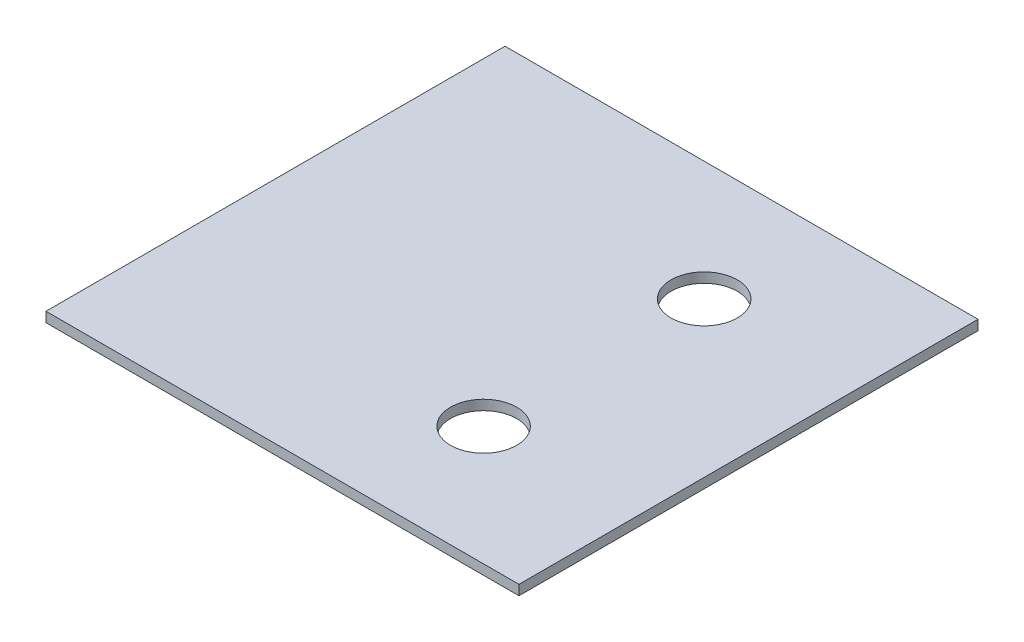
ISO-10303-21;
HEADER;
FILE_DESCRIPTION(('STEP AP214'),'2;1');
FILE_NAME('part.step','',(''),(''),'','','');
FILE_SCHEMA(('AUTOMOTIVE_DESIGN { 1 0 10303 214 1 1 1 1 }'));
ENDSEC;
DATA;
#1=APPLICATION_CONTEXT('core data for automotive mechanical design processes');
#2=APPLICATION_PROTOCOL_DEFINITION('international standard','automotive_design',2000,#1);
#3=PRODUCT_CONTEXT('',#1,'mechanical');
#4=PRODUCT('Part','Part','',(#3));
#5=PRODUCT_RELATED_PRODUCT_CATEGORY('part','',(#4));
#6=PRODUCT_DEFINITION_FORMATION('','',#4);
#7=PRODUCT_DEFINITION_CONTEXT('part definition',#1,'design');
#8=PRODUCT_DEFINITION('design','',#6,#7);
#9=PRODUCT_DEFINITION_SHAPE('','',#8);
#10=(LENGTH_UNIT() NAMED_UNIT(*) SI_UNIT(.MILLI.,.METRE.));
#11=(NAMED_UNIT(*) PLANE_ANGLE_UNIT() SI_UNIT($,.RADIAN.));
#12=(NAMED_UNIT(*) SI_UNIT($,.STERADIAN.) SOLID_ANGLE_UNIT());
#13=UNCERTAINTY_MEASURE_WITH_UNIT(LENGTH_MEASURE(1.E-05),#10,'distance_accuracy_value','');
#14=(GEOMETRIC_REPRESENTATION_CONTEXT(3) GLOBAL_UNCERTAINTY_ASSIGNED_CONTEXT((#13)) GLOBAL_UNIT_ASSIGNED_CONTEXT((#10,
#11,#12)) REPRESENTATION_CONTEXT('',''));
#15=CARTESIAN_POINT('',(0.,0.,0.));
#16=DIRECTION('',(0.,0.,1.));
#17=DIRECTION('',(1.,0.,0.));
#18=AXIS2_PLACEMENT_3D('',#15,#16,#17);
#19=CARTESIAN_POINT('',(11.9,0.5,-11.55));
#20=DIRECTION('',(-1.,0.,0.));
#21=DIRECTION('',(0.,0.,1.));
#22=AXIS2_PLACEMENT_3D('',#19,#20,#21);
#23=PLANE('',#22);
#24=DIRECTION('',(0.,0.,-1.));
#25=VECTOR('',#24,1.);
#26=CARTESIAN_POINT('',(11.9,0.,-11.55));
#27=LINE('',#26,#25);
#28=CARTESIAN_POINT('',(11.9,0.,11.55));
#29=VERTEX_POINT('',#28);
#30=CARTESIAN_POINT('',(11.9,0.,-11.55));
#31=VERTEX_POINT('',#30);
#32=EDGE_CURVE('E118',#29,#31,#27,.T.);
#33=ORIENTED_EDGE('',*,*,#32,.T.);
#34=DIRECTION('',(0.,-1.,0.));
#35=VECTOR('',#34,1.);
#36=CARTESIAN_POINT('',(11.9,0.5,-11.55));
#37=LINE('',#36,#35);
#38=CARTESIAN_POINT('',(11.9,0.5,-11.55));
#39=VERTEX_POINT('',#38);
#40=EDGE_CURVE('E11',#39,#31,#37,.T.);
#41=ORIENTED_EDGE('',*,*,#40,.F.);
#42=DIRECTION('',(0.,0.,-1.));
#43=VECTOR('',#42,1.);
#44=CARTESIAN_POINT('',(11.9,0.5,-11.55));
#45=LINE('',#44,#43);
#46=CARTESIAN_POINT('',(11.9,0.5,11.55));
#47=VERTEX_POINT('',#46);
#48=EDGE_CURVE('E100',#47,#39,#45,.T.);
#49=ORIENTED_EDGE('',*,*,#48,.F.);
#50=DIRECTION('',(0.,-1.,0.));
#51=VECTOR('',#50,1.);
#52=CARTESIAN_POINT('',(11.9,0.5,11.55));
#53=LINE('',#52,#51);
#54=EDGE_CURVE('E114',#47,#29,#53,.T.);
#55=ORIENTED_EDGE('',*,*,#54,.T.);
#56=EDGE_LOOP('',(#33,#41,#49,#55));
#57=FACE_BOUND('',#56,.T.);
#58=ADVANCED_FACE('F40',(#57),#23,.F.);
#59=CARTESIAN_POINT('',(-11.9,0.5,-11.55));
#60=DIRECTION('',(0.,0.,1.));
#61=DIRECTION('',(1.,0.,0.));
#62=AXIS2_PLACEMENT_3D('',#59,#60,#61);
#63=PLANE('',#62);
#64=DIRECTION('',(-1.,0.,0.));
#65=VECTOR('',#64,1.);
#66=CARTESIAN_POINT('',(-11.9,0.,-11.55));
#67=LINE('',#66,#65);
#68=CARTESIAN_POINT('',(-11.9,0.,-11.55));
#69=VERTEX_POINT('',#68);
#70=EDGE_CURVE('E105',#31,#69,#67,.T.);
#71=ORIENTED_EDGE('',*,*,#70,.T.);
#72=DIRECTION('',(0.,-1.,0.));
#73=VECTOR('',#72,1.);
#74=CARTESIAN_POINT('',(-11.9,0.5,-11.55));
#75=LINE('',#74,#73);
#76=CARTESIAN_POINT('',(-11.9,0.5,-11.55));
#77=VERTEX_POINT('',#76);
#78=EDGE_CURVE('E49',#77,#69,#75,.T.);
#79=ORIENTED_EDGE('',*,*,#78,.F.);
#80=DIRECTION('',(-1.,0.,0.));
#81=VECTOR('',#80,1.);
#82=CARTESIAN_POINT('',(-11.9,0.5,-11.55));
#83=LINE('',#82,#81);
#84=EDGE_CURVE('E94',#39,#77,#83,.T.);
#85=ORIENTED_EDGE('',*,*,#84,.F.);
#86=ORIENTED_EDGE('',*,*,#40,.T.);
#87=EDGE_LOOP('',(#71,#79,#85,#86));
#88=FACE_BOUND('',#87,.T.);
#89=ADVANCED_FACE('F104',(#88),#63,.F.);
#90=CARTESIAN_POINT('',(-11.9,0.5,-11.55));
#91=DIRECTION('',(1.,0.,0.));
#92=DIRECTION('',(0.,0.,-1.));
#93=AXIS2_PLACEMENT_3D('',#90,#91,#92);
#94=PLANE('',#93);
#95=DIRECTION('',(0.,0.,1.));
#96=VECTOR('',#95,1.);
#97=CARTESIAN_POINT('',(-11.9,0.,-11.55));
#98=LINE('',#97,#96);
#99=CARTESIAN_POINT('',(-11.9,0.,11.55));
#100=VERTEX_POINT('',#99);
#101=EDGE_CURVE('E80',#69,#100,#98,.T.);
#102=ORIENTED_EDGE('',*,*,#101,.T.);
#103=DIRECTION('',(0.,-1.,0.));
#104=VECTOR('',#103,1.);
#105=CARTESIAN_POINT('',(-11.9,0.5,11.55));
#106=LINE('',#105,#104);
#107=CARTESIAN_POINT('',(-11.9,0.5,11.55));
#108=VERTEX_POINT('',#107);
#109=EDGE_CURVE('E107',#108,#100,#106,.T.);
#110=ORIENTED_EDGE('',*,*,#109,.F.);
#111=DIRECTION('',(0.,0.,1.));
#112=VECTOR('',#111,1.);
#113=CARTESIAN_POINT('',(-11.9,0.5,-11.55));
#114=LINE('',#113,#112);
#115=EDGE_CURVE('E98',#77,#108,#114,.T.);
#116=ORIENTED_EDGE('',*,*,#115,.F.);
#117=ORIENTED_EDGE('',*,*,#78,.T.);
#118=EDGE_LOOP('',(#102,#110,#116,#117));
#119=FACE_BOUND('',#118,.T.);
#120=ADVANCED_FACE('F108',(#119),#94,.F.);
#121=CARTESIAN_POINT('',(-11.9,0.5,11.55));
#122=DIRECTION('',(0.,0.,-1.));
#123=DIRECTION('',(-1.,0.,0.));
#124=AXIS2_PLACEMENT_3D('',#121,#122,#123);
#125=PLANE('',#124);
#126=DIRECTION('',(1.,0.,0.));
#127=VECTOR('',#126,1.);
#128=CARTESIAN_POINT('',(-11.9,0.,11.55));
#129=LINE('',#128,#127);
#130=EDGE_CURVE('E86',#100,#29,#129,.T.);
#131=ORIENTED_EDGE('',*,*,#130,.T.);
#132=ORIENTED_EDGE('',*,*,#54,.F.);
#133=DIRECTION('',(1.,0.,0.));
#134=VECTOR('',#133,1.);
#135=CARTESIAN_POINT('',(-11.9,0.5,11.55));
#136=LINE('',#135,#134);
#137=EDGE_CURVE('E60',#108,#47,#136,.T.);
#138=ORIENTED_EDGE('',*,*,#137,.F.);
#139=ORIENTED_EDGE('',*,*,#109,.T.);
#140=EDGE_LOOP('',(#131,#132,#138,#139));
#141=FACE_BOUND('',#140,.T.);
#142=ADVANCED_FACE('F131',(#141),#125,.F.);
#143=CARTESIAN_POINT('',(0.,0.5,0.));
#144=DIRECTION('',(0.,1.,0.));
#145=DIRECTION('',(0.,0.,1.));
#146=AXIS2_PLACEMENT_3D('',#143,#144,#145);
#147=PLANE('',#146);
#148=CARTESIAN_POINT('',(4.12138086569771,0.5,-5.54938636770919));
#149=DIRECTION('',(0.,1.,0.));
#150=DIRECTION('',(0.,0.,1.));
#151=AXIS2_PLACEMENT_3D('',#148,#149,#150);
#152=CIRCLE('',#151,1.665);
#153=CARTESIAN_POINT('',(4.12138086569771,0.5,-3.88438636770919));
#154=VERTEX_POINT('',#153);
#155=EDGE_CURVE('E142',#154,#154,#152,.T.);
#156=ORIENTED_EDGE('',*,*,#155,.F.);
#157=EDGE_LOOP('',(#156));
#158=FACE_BOUND('',#157,.T.);
#159=CARTESIAN_POINT('',(4.12138086569771,0.5,5.55000000000002));
#160=DIRECTION('',(0.,1.,0.));
#161=DIRECTION('',(0.,0.,1.));
#162=AXIS2_PLACEMENT_3D('',#159,#160,#161);
#163=CIRCLE('',#162,1.665);
#164=CARTESIAN_POINT('',(4.12138086569771,0.5,7.21500000000002));
#165=VERTEX_POINT('',#164);
#166=EDGE_CURVE('E143',#165,#165,#163,.T.);
#167=ORIENTED_EDGE('',*,*,#166,.F.);
#168=EDGE_LOOP('',(#167));
#169=FACE_BOUND('',#168,.T.);
#170=ORIENTED_EDGE('',*,*,#48,.T.);
#171=ORIENTED_EDGE('',*,*,#84,.T.);
#172=ORIENTED_EDGE('',*,*,#115,.T.);
#173=ORIENTED_EDGE('',*,*,#137,.T.);
#174=EDGE_LOOP('',(#170,#171,#172,#173));
#175=FACE_BOUND('',#174,.T.);
#176=ADVANCED_FACE('F96',(#158,#169,#175),#147,.T.);
#177=CARTESIAN_POINT('',(0.,0.,0.));
#178=DIRECTION('',(0.,1.,0.));
#179=DIRECTION('',(0.,0.,1.));
#180=AXIS2_PLACEMENT_3D('',#177,#178,#179);
#181=PLANE('',#180);
#182=CARTESIAN_POINT('',(4.12138086569771,0.,-5.54938636770919));
#183=DIRECTION('',(0.,1.,0.));
#184=DIRECTION('',(0.,0.,1.));
#185=AXIS2_PLACEMENT_3D('',#182,#183,#184);
#186=CIRCLE('',#185,1.665);
#187=CARTESIAN_POINT('',(4.12138086569771,0.,-3.88438636770919));
#188=VERTEX_POINT('',#187);
#189=EDGE_CURVE('E122',#188,#188,#186,.F.);
#190=ORIENTED_EDGE('',*,*,#189,.F.);
#191=EDGE_LOOP('',(#190));
#192=FACE_BOUND('',#191,.T.);
#193=CARTESIAN_POINT('',(4.12138086569771,0.,5.55000000000002));
#194=DIRECTION('',(0.,1.,0.));
#195=DIRECTION('',(0.,0.,1.));
#196=AXIS2_PLACEMENT_3D('',#193,#194,#195);
#197=CIRCLE('',#196,1.665);
#198=CARTESIAN_POINT('',(4.12138086569771,0.,7.21500000000002));
#199=VERTEX_POINT('',#198);
#200=EDGE_CURVE('E138',#199,#199,#197,.F.);
#201=ORIENTED_EDGE('',*,*,#200,.F.);
#202=EDGE_LOOP('',(#201));
#203=FACE_BOUND('',#202,.T.);
#204=ORIENTED_EDGE('',*,*,#32,.F.);
#205=ORIENTED_EDGE('',*,*,#130,.F.);
#206=ORIENTED_EDGE('',*,*,#101,.F.);
#207=ORIENTED_EDGE('',*,*,#70,.F.);
#208=EDGE_LOOP('',(#204,#205,#206,#207));
#209=FACE_BOUND('',#208,.T.);
#210=ADVANCED_FACE('F134',(#192,#203,#209),#181,.F.);
#211=CARTESIAN_POINT('',(4.12138086569771,-0.00100000000000002,5.55000000000002));
#212=DIRECTION('',(0.,1.,0.));
#213=DIRECTION('',(0.,0.,1.));
#214=AXIS2_PLACEMENT_3D('',#211,#212,#213);
#215=CYLINDRICAL_SURFACE('',#214,1.665);
#216=ORIENTED_EDGE('',*,*,#166,.T.);
#217=EDGE_LOOP('',(#216));
#218=FACE_BOUND('',#217,.T.);
#219=ORIENTED_EDGE('',*,*,#200,.T.);
#220=EDGE_LOOP('',(#219));
#221=FACE_BOUND('',#220,.T.);
#222=ADVANCED_FACE('F161',(#218,#221),#215,.F.);
#223=CARTESIAN_POINT('',(4.12138086569771,-0.00100000000000002,-5.54938636770919));
#224=DIRECTION('',(0.,1.,0.));
#225=DIRECTION('',(0.,0.,1.));
#226=AXIS2_PLACEMENT_3D('',#223,#224,#225);
#227=CYLINDRICAL_SURFACE('',#226,1.665);
#228=ORIENTED_EDGE('',*,*,#155,.T.);
#229=EDGE_LOOP('',(#228));
#230=FACE_BOUND('',#229,.T.);
#231=ORIENTED_EDGE('',*,*,#189,.T.);
#232=EDGE_LOOP('',(#231));
#233=FACE_BOUND('',#232,.T.);
#234=ADVANCED_FACE('F153',(#230,#233),#227,.F.);
#235=CLOSED_SHELL('',(#58,#89,#120,#142,#176,#210,#222,#234));
#236=MANIFOLD_SOLID_BREP('B2',#235);
#237=ADVANCED_BREP_SHAPE_REPRESENTATION('',(#18,#236),#14);
#238=SHAPE_DEFINITION_REPRESENTATION(#9,#237);
ENDSEC;
END-ISO-10303-21;
